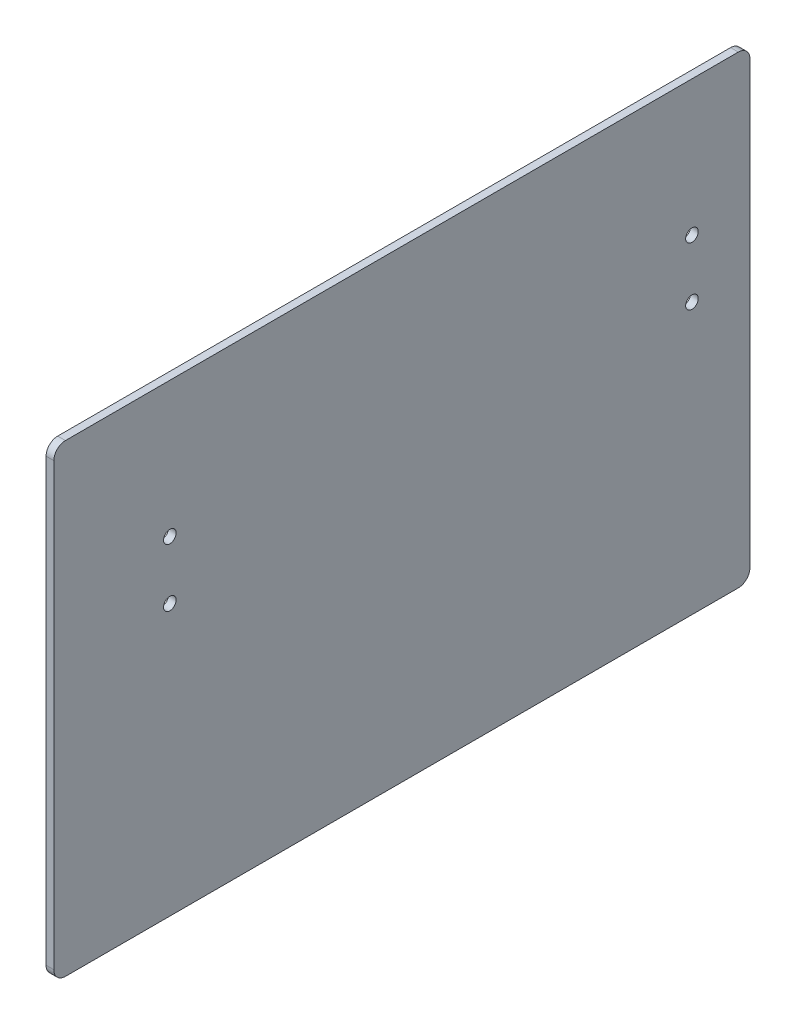
ISO-10303-21;
HEADER;
FILE_DESCRIPTION(('STEP AP214'),'2;1');
FILE_NAME('part.step','',(''),(''),'','','');
FILE_SCHEMA(('AUTOMOTIVE_DESIGN { 1 0 10303 214 1 1 1 1 }'));
ENDSEC;
DATA;
#1=APPLICATION_CONTEXT('core data for automotive mechanical design processes');
#2=APPLICATION_PROTOCOL_DEFINITION('international standard','automotive_design',2000,#1);
#3=PRODUCT_CONTEXT('',#1,'mechanical');
#4=PRODUCT('Part','Part','',(#3));
#5=PRODUCT_RELATED_PRODUCT_CATEGORY('part','',(#4));
#6=PRODUCT_DEFINITION_FORMATION('','',#4);
#7=PRODUCT_DEFINITION_CONTEXT('part definition',#1,'design');
#8=PRODUCT_DEFINITION('design','',#6,#7);
#9=PRODUCT_DEFINITION_SHAPE('','',#8);
#10=(LENGTH_UNIT() NAMED_UNIT(*) SI_UNIT(.MILLI.,.METRE.));
#11=(NAMED_UNIT(*) PLANE_ANGLE_UNIT() SI_UNIT($,.RADIAN.));
#12=(NAMED_UNIT(*) SI_UNIT($,.STERADIAN.) SOLID_ANGLE_UNIT());
#13=UNCERTAINTY_MEASURE_WITH_UNIT(LENGTH_MEASURE(1.E-05),#10,'distance_accuracy_value','');
#14=(GEOMETRIC_REPRESENTATION_CONTEXT(3) GLOBAL_UNCERTAINTY_ASSIGNED_CONTEXT((#13)) GLOBAL_UNIT_ASSIGNED_CONTEXT((#10,
#11,#12)) REPRESENTATION_CONTEXT('',''));
#15=CARTESIAN_POINT('',(0.,0.,0.));
#16=DIRECTION('',(0.,0.,1.));
#17=DIRECTION('',(1.,0.,0.));
#18=AXIS2_PLACEMENT_3D('',#15,#16,#17);
#19=CARTESIAN_POINT('',(2.,-102.75,-180.));
#20=DIRECTION('',(0.,0.,1.));
#21=DIRECTION('',(1.,0.,0.));
#22=AXIS2_PLACEMENT_3D('',#19,#20,#21);
#23=PLANE('',#22);
#24=DIRECTION('',(0.,1.,0.));
#25=VECTOR('',#24,1.);
#26=CARTESIAN_POINT('',(2.,-102.75,-180.));
#27=LINE('',#26,#25);
#28=CARTESIAN_POINT('',(2.,-96.7500000000001,-180.));
#29=VERTEX_POINT('',#28);
#30=CARTESIAN_POINT('',(2.,131.25,-180.));
#31=VERTEX_POINT('',#30);
#32=EDGE_CURVE('E133',#29,#31,#27,.T.);
#33=ORIENTED_EDGE('',*,*,#32,.F.);
#34=DIRECTION('',(-1.,0.,0.));
#35=VECTOR('',#34,1.);
#36=CARTESIAN_POINT('',(2.,-96.7500000000001,-180.));
#37=LINE('',#36,#35);
#38=CARTESIAN_POINT('',(-2.,-96.7500000000001,-180.));
#39=VERTEX_POINT('',#38);
#40=EDGE_CURVE('E160',#29,#39,#37,.T.);
#41=ORIENTED_EDGE('',*,*,#40,.T.);
#42=DIRECTION('',(0.,1.,0.));
#43=VECTOR('',#42,1.);
#44=CARTESIAN_POINT('',(-2.,-102.75,-180.));
#45=LINE('',#44,#43);
#46=CARTESIAN_POINT('',(-2.,131.25,-180.));
#47=VERTEX_POINT('',#46);
#48=EDGE_CURVE('E164',#39,#47,#45,.T.);
#49=ORIENTED_EDGE('',*,*,#48,.T.);
#50=DIRECTION('',(-1.,0.,0.));
#51=VECTOR('',#50,1.);
#52=CARTESIAN_POINT('',(2.,131.25,-180.));
#53=LINE('',#52,#51);
#54=EDGE_CURVE('E159',#47,#31,#53,.F.);
#55=ORIENTED_EDGE('',*,*,#54,.T.);
#56=EDGE_LOOP('',(#33,#41,#49,#55));
#57=FACE_BOUND('',#56,.T.);
#58=ADVANCED_FACE('F41',(#57),#23,.F.);
#59=CARTESIAN_POINT('',(2.,137.25,180.));
#60=DIRECTION('',(0.,-1.,0.));
#61=DIRECTION('',(0.,0.,-1.));
#62=AXIS2_PLACEMENT_3D('',#59,#60,#61);
#63=PLANE('',#62);
#64=DIRECTION('',(0.,0.,1.));
#65=VECTOR('',#64,1.);
#66=CARTESIAN_POINT('',(2.,137.25,180.));
#67=LINE('',#66,#65);
#68=CARTESIAN_POINT('',(2.,137.25,-174.));
#69=VERTEX_POINT('',#68);
#70=CARTESIAN_POINT('',(2.,137.25,174.));
#71=VERTEX_POINT('',#70);
#72=EDGE_CURVE('E138',#69,#71,#67,.T.);
#73=ORIENTED_EDGE('',*,*,#72,.F.);
#74=DIRECTION('',(-1.,0.,0.));
#75=VECTOR('',#74,1.);
#76=CARTESIAN_POINT('',(2.,137.25,-174.));
#77=LINE('',#76,#75);
#78=CARTESIAN_POINT('',(-2.,137.25,-174.));
#79=VERTEX_POINT('',#78);
#80=EDGE_CURVE('E11',#69,#79,#77,.T.);
#81=ORIENTED_EDGE('',*,*,#80,.T.);
#82=DIRECTION('',(0.,0.,1.));
#83=VECTOR('',#82,1.);
#84=CARTESIAN_POINT('',(-2.,137.25,180.));
#85=LINE('',#84,#83);
#86=CARTESIAN_POINT('',(-2.,137.25,174.));
#87=VERTEX_POINT('',#86);
#88=EDGE_CURVE('E137',#79,#87,#85,.T.);
#89=ORIENTED_EDGE('',*,*,#88,.T.);
#90=DIRECTION('',(-1.,0.,0.));
#91=VECTOR('',#90,1.);
#92=CARTESIAN_POINT('',(2.,137.25,174.));
#93=LINE('',#92,#91);
#94=EDGE_CURVE('E47',#87,#71,#93,.F.);
#95=ORIENTED_EDGE('',*,*,#94,.T.);
#96=EDGE_LOOP('',(#73,#81,#89,#95));
#97=FACE_BOUND('',#96,.T.);
#98=ADVANCED_FACE('F217',(#97),#63,.F.);
#99=CARTESIAN_POINT('',(2.,-102.75,180.));
#100=DIRECTION('',(0.,0.,-1.));
#101=DIRECTION('',(-1.,0.,0.));
#102=AXIS2_PLACEMENT_3D('',#99,#100,#101);
#103=PLANE('',#102);
#104=DIRECTION('',(0.,-1.,0.));
#105=VECTOR('',#104,1.);
#106=CARTESIAN_POINT('',(-2.,-102.75,180.));
#107=LINE('',#106,#105);
#108=CARTESIAN_POINT('',(-2.,131.25,180.));
#109=VERTEX_POINT('',#108);
#110=CARTESIAN_POINT('',(-2.,-96.7500000000001,180.));
#111=VERTEX_POINT('',#110);
#112=EDGE_CURVE('E132',#109,#111,#107,.T.);
#113=ORIENTED_EDGE('',*,*,#112,.T.);
#114=DIRECTION('',(-1.,0.,0.));
#115=VECTOR('',#114,1.);
#116=CARTESIAN_POINT('',(2.,-96.7500000000001,180.));
#117=LINE('',#116,#115);
#118=CARTESIAN_POINT('',(2.,-96.7500000000001,180.));
#119=VERTEX_POINT('',#118);
#120=EDGE_CURVE('E115',#111,#119,#117,.F.);
#121=ORIENTED_EDGE('',*,*,#120,.T.);
#122=DIRECTION('',(0.,-1.,0.));
#123=VECTOR('',#122,1.);
#124=CARTESIAN_POINT('',(2.,-102.75,180.));
#125=LINE('',#124,#123);
#126=CARTESIAN_POINT('',(2.,131.25,180.));
#127=VERTEX_POINT('',#126);
#128=EDGE_CURVE('E180',#127,#119,#125,.T.);
#129=ORIENTED_EDGE('',*,*,#128,.F.);
#130=DIRECTION('',(-1.,0.,0.));
#131=VECTOR('',#130,1.);
#132=CARTESIAN_POINT('',(2.,131.25,180.));
#133=LINE('',#132,#131);
#134=EDGE_CURVE('E120',#127,#109,#133,.T.);
#135=ORIENTED_EDGE('',*,*,#134,.T.);
#136=EDGE_LOOP('',(#113,#121,#129,#135));
#137=FACE_BOUND('',#136,.T.);
#138=ADVANCED_FACE('F220',(#137),#103,.F.);
#139=CARTESIAN_POINT('',(2.,-102.75,180.));
#140=DIRECTION('',(0.,1.,0.));
#141=DIRECTION('',(0.,0.,1.));
#142=AXIS2_PLACEMENT_3D('',#139,#140,#141);
#143=PLANE('',#142);
#144=DIRECTION('',(0.,0.,-1.));
#145=VECTOR('',#144,1.);
#146=CARTESIAN_POINT('',(2.,-102.75,180.));
#147=LINE('',#146,#145);
#148=CARTESIAN_POINT('',(2.,-102.75,174.));
#149=VERTEX_POINT('',#148);
#150=CARTESIAN_POINT('',(2.,-102.75,-174.));
#151=VERTEX_POINT('',#150);
#152=EDGE_CURVE('E130',#149,#151,#147,.T.);
#153=ORIENTED_EDGE('',*,*,#152,.F.);
#154=DIRECTION('',(-1.,0.,0.));
#155=VECTOR('',#154,1.);
#156=CARTESIAN_POINT('',(2.,-102.75,174.));
#157=LINE('',#156,#155);
#158=CARTESIAN_POINT('',(-2.,-102.75,174.));
#159=VERTEX_POINT('',#158);
#160=EDGE_CURVE('E111',#149,#159,#157,.T.);
#161=ORIENTED_EDGE('',*,*,#160,.T.);
#162=DIRECTION('',(0.,0.,-1.));
#163=VECTOR('',#162,1.);
#164=CARTESIAN_POINT('',(-2.,-102.75,180.));
#165=LINE('',#164,#163);
#166=CARTESIAN_POINT('',(-2.,-102.75,-174.));
#167=VERTEX_POINT('',#166);
#168=EDGE_CURVE('E121',#159,#167,#165,.T.);
#169=ORIENTED_EDGE('',*,*,#168,.T.);
#170=DIRECTION('',(-1.,0.,0.));
#171=VECTOR('',#170,1.);
#172=CARTESIAN_POINT('',(2.,-102.75,-174.));
#173=LINE('',#172,#171);
#174=EDGE_CURVE('E129',#167,#151,#173,.F.);
#175=ORIENTED_EDGE('',*,*,#174,.T.);
#176=EDGE_LOOP('',(#153,#161,#169,#175));
#177=FACE_BOUND('',#176,.T.);
#178=ADVANCED_FACE('F124',(#177),#143,.F.);
#179=CARTESIAN_POINT('',(2.,0.,0.));
#180=DIRECTION('',(-1.,0.,0.));
#181=DIRECTION('',(0.,0.,1.));
#182=AXIS2_PLACEMENT_3D('',#179,#180,#181);
#183=PLANE('',#182);
#184=CARTESIAN_POINT('',(2.,67.2499999999999,120.));
#185=DIRECTION('',(1.,0.,0.));
#186=DIRECTION('',(0.,0.,-1.));
#187=AXIS2_PLACEMENT_3D('',#184,#185,#186);
#188=CIRCLE('',#187,3.24999999999999);
#189=CARTESIAN_POINT('',(2.,67.2499999999999,116.75));
#190=VERTEX_POINT('',#189);
#191=EDGE_CURVE('E198',#190,#190,#188,.T.);
#192=ORIENTED_EDGE('',*,*,#191,.F.);
#193=EDGE_LOOP('',(#192));
#194=FACE_BOUND('',#193,.T.);
#195=CARTESIAN_POINT('',(2.,37.2499999999997,-150.));
#196=DIRECTION('',(1.,0.,0.));
#197=DIRECTION('',(0.,0.,-1.));
#198=AXIS2_PLACEMENT_3D('',#195,#196,#197);
#199=CIRCLE('',#198,3.24999999999999);
#200=CARTESIAN_POINT('',(2.,37.2499999999997,-153.25));
#201=VERTEX_POINT('',#200);
#202=EDGE_CURVE('E195',#201,#201,#199,.T.);
#203=ORIENTED_EDGE('',*,*,#202,.F.);
#204=EDGE_LOOP('',(#203));
#205=FACE_BOUND('',#204,.T.);
#206=CARTESIAN_POINT('',(2.,37.2499999999999,120.));
#207=DIRECTION('',(1.,0.,0.));
#208=DIRECTION('',(0.,0.,-1.));
#209=AXIS2_PLACEMENT_3D('',#206,#207,#208);
#210=CIRCLE('',#209,3.24999999999999);
#211=CARTESIAN_POINT('',(2.,37.2499999999999,116.75));
#212=VERTEX_POINT('',#211);
#213=EDGE_CURVE('E187',#212,#212,#210,.T.);
#214=ORIENTED_EDGE('',*,*,#213,.F.);
#215=EDGE_LOOP('',(#214));
#216=FACE_BOUND('',#215,.T.);
#217=CARTESIAN_POINT('',(2.,67.2499999999999,-150.));
#218=DIRECTION('',(1.,0.,0.));
#219=DIRECTION('',(0.,0.,-1.));
#220=AXIS2_PLACEMENT_3D('',#217,#218,#219);
#221=CIRCLE('',#220,3.24999999999999);
#222=CARTESIAN_POINT('',(2.,67.2499999999999,-153.25));
#223=VERTEX_POINT('',#222);
#224=EDGE_CURVE('E173',#223,#223,#221,.T.);
#225=ORIENTED_EDGE('',*,*,#224,.F.);
#226=EDGE_LOOP('',(#225));
#227=FACE_BOUND('',#226,.T.);
#228=ORIENTED_EDGE('',*,*,#128,.T.);
#229=CARTESIAN_POINT('',(2.,-96.7500000000001,174.));
#230=DIRECTION('',(-1.,0.,0.));
#231=DIRECTION('',(0.,0.,1.));
#232=AXIS2_PLACEMENT_3D('',#229,#230,#231);
#233=CIRCLE('',#232,6.);
#234=EDGE_CURVE('E154',#119,#149,#233,.F.);
#235=ORIENTED_EDGE('',*,*,#234,.T.);
#236=ORIENTED_EDGE('',*,*,#152,.T.);
#237=CARTESIAN_POINT('',(2.,-96.7500000000001,-174.));
#238=DIRECTION('',(-1.,0.,0.));
#239=DIRECTION('',(0.,0.,1.));
#240=AXIS2_PLACEMENT_3D('',#237,#238,#239);
#241=CIRCLE('',#240,6.);
#242=EDGE_CURVE('E153',#151,#29,#241,.F.);
#243=ORIENTED_EDGE('',*,*,#242,.T.);
#244=ORIENTED_EDGE('',*,*,#32,.T.);
#245=CARTESIAN_POINT('',(2.,131.25,-174.));
#246=DIRECTION('',(-1.,0.,0.));
#247=DIRECTION('',(0.,0.,1.));
#248=AXIS2_PLACEMENT_3D('',#245,#246,#247);
#249=CIRCLE('',#248,6.);
#250=EDGE_CURVE('E65',#31,#69,#249,.F.);
#251=ORIENTED_EDGE('',*,*,#250,.T.);
#252=ORIENTED_EDGE('',*,*,#72,.T.);
#253=CARTESIAN_POINT('',(2.,131.25,174.));
#254=DIRECTION('',(-1.,0.,0.));
#255=DIRECTION('',(0.,0.,1.));
#256=AXIS2_PLACEMENT_3D('',#253,#254,#255);
#257=CIRCLE('',#256,6.);
#258=EDGE_CURVE('E147',#71,#127,#257,.F.);
#259=ORIENTED_EDGE('',*,*,#258,.T.);
#260=EDGE_LOOP('',(#228,#235,#236,#243,#244,#251,#252,#259));
#261=FACE_BOUND('',#260,.T.);
#262=ADVANCED_FACE('F205',(#194,#205,#216,#227,#261),#183,.F.);
#263=CARTESIAN_POINT('',(-2.,0.,0.));
#264=DIRECTION('',(-1.,0.,0.));
#265=DIRECTION('',(0.,0.,1.));
#266=AXIS2_PLACEMENT_3D('',#263,#264,#265);
#267=PLANE('',#266);
#268=CARTESIAN_POINT('',(-2.,67.2499999999999,120.));
#269=DIRECTION('',(1.,0.,0.));
#270=DIRECTION('',(0.,0.,-1.));
#271=AXIS2_PLACEMENT_3D('',#268,#269,#270);
#272=CIRCLE('',#271,3.25);
#273=CARTESIAN_POINT('',(-2.,67.2499999999999,116.75));
#274=VERTEX_POINT('',#273);
#275=EDGE_CURVE('E192',#274,#274,#272,.T.);
#276=ORIENTED_EDGE('',*,*,#275,.T.);
#277=EDGE_LOOP('',(#276));
#278=FACE_BOUND('',#277,.T.);
#279=CARTESIAN_POINT('',(-2.,37.2499999999997,-150.));
#280=DIRECTION('',(1.,0.,0.));
#281=DIRECTION('',(0.,0.,-1.));
#282=AXIS2_PLACEMENT_3D('',#279,#280,#281);
#283=CIRCLE('',#282,3.25);
#284=CARTESIAN_POINT('',(-2.,37.2499999999997,-153.25));
#285=VERTEX_POINT('',#284);
#286=EDGE_CURVE('E186',#285,#285,#283,.T.);
#287=ORIENTED_EDGE('',*,*,#286,.T.);
#288=EDGE_LOOP('',(#287));
#289=FACE_BOUND('',#288,.T.);
#290=CARTESIAN_POINT('',(-2.,37.2499999999999,120.));
#291=DIRECTION('',(1.,0.,0.));
#292=DIRECTION('',(0.,0.,-1.));
#293=AXIS2_PLACEMENT_3D('',#290,#291,#292);
#294=CIRCLE('',#293,3.25);
#295=CARTESIAN_POINT('',(-2.,37.2499999999999,116.75));
#296=VERTEX_POINT('',#295);
#297=EDGE_CURVE('E182',#296,#296,#294,.T.);
#298=ORIENTED_EDGE('',*,*,#297,.T.);
#299=EDGE_LOOP('',(#298));
#300=FACE_BOUND('',#299,.T.);
#301=CARTESIAN_POINT('',(-2.,67.2499999999999,-150.));
#302=DIRECTION('',(1.,0.,0.));
#303=DIRECTION('',(0.,0.,-1.));
#304=AXIS2_PLACEMENT_3D('',#301,#302,#303);
#305=CIRCLE('',#304,3.25);
#306=CARTESIAN_POINT('',(-2.,67.2499999999999,-153.25));
#307=VERTEX_POINT('',#306);
#308=EDGE_CURVE('E167',#307,#307,#305,.T.);
#309=ORIENTED_EDGE('',*,*,#308,.T.);
#310=EDGE_LOOP('',(#309));
#311=FACE_BOUND('',#310,.T.);
#312=ORIENTED_EDGE('',*,*,#168,.F.);
#313=CARTESIAN_POINT('',(-2.,-96.7500000000001,174.));
#314=DIRECTION('',(-1.,0.,0.));
#315=DIRECTION('',(0.,0.,1.));
#316=AXIS2_PLACEMENT_3D('',#313,#314,#315);
#317=CIRCLE('',#316,6.);
#318=EDGE_CURVE('E110',#159,#111,#317,.T.);
#319=ORIENTED_EDGE('',*,*,#318,.T.);
#320=ORIENTED_EDGE('',*,*,#112,.F.);
#321=CARTESIAN_POINT('',(-2.,131.25,174.));
#322=DIRECTION('',(-1.,0.,0.));
#323=DIRECTION('',(0.,0.,1.));
#324=AXIS2_PLACEMENT_3D('',#321,#322,#323);
#325=CIRCLE('',#324,6.);
#326=EDGE_CURVE('E126',#109,#87,#325,.T.);
#327=ORIENTED_EDGE('',*,*,#326,.T.);
#328=ORIENTED_EDGE('',*,*,#88,.F.);
#329=CARTESIAN_POINT('',(-2.,131.25,-174.));
#330=DIRECTION('',(-1.,0.,0.));
#331=DIRECTION('',(0.,0.,1.));
#332=AXIS2_PLACEMENT_3D('',#329,#330,#331);
#333=CIRCLE('',#332,6.);
#334=EDGE_CURVE('E144',#79,#47,#333,.T.);
#335=ORIENTED_EDGE('',*,*,#334,.T.);
#336=ORIENTED_EDGE('',*,*,#48,.F.);
#337=CARTESIAN_POINT('',(-2.,-96.7500000000001,-174.));
#338=DIRECTION('',(-1.,0.,0.));
#339=DIRECTION('',(0.,0.,1.));
#340=AXIS2_PLACEMENT_3D('',#337,#338,#339);
#341=CIRCLE('',#340,6.);
#342=EDGE_CURVE('E117',#39,#167,#341,.T.);
#343=ORIENTED_EDGE('',*,*,#342,.T.);
#344=EDGE_LOOP('',(#312,#319,#320,#327,#328,#335,#336,#343));
#345=FACE_BOUND('',#344,.T.);
#346=ADVANCED_FACE('F131',(#278,#289,#300,#311,#345),#267,.T.);
#347=CARTESIAN_POINT('',(2.,-96.7500000000001,174.));
#348=DIRECTION('',(-1.,0.,0.));
#349=DIRECTION('',(0.,0.,1.));
#350=AXIS2_PLACEMENT_3D('',#347,#348,#349);
#351=CYLINDRICAL_SURFACE('',#350,6.);
#352=ORIENTED_EDGE('',*,*,#234,.F.);
#353=ORIENTED_EDGE('',*,*,#120,.F.);
#354=ORIENTED_EDGE('',*,*,#318,.F.);
#355=ORIENTED_EDGE('',*,*,#160,.F.);
#356=EDGE_LOOP('',(#352,#353,#354,#355));
#357=FACE_BOUND('',#356,.T.);
#358=ADVANCED_FACE('F109',(#357),#351,.T.);
#359=CARTESIAN_POINT('',(2.,-96.7500000000001,-174.));
#360=DIRECTION('',(-1.,0.,0.));
#361=DIRECTION('',(0.,0.,1.));
#362=AXIS2_PLACEMENT_3D('',#359,#360,#361);
#363=CYLINDRICAL_SURFACE('',#362,6.);
#364=ORIENTED_EDGE('',*,*,#242,.F.);
#365=ORIENTED_EDGE('',*,*,#174,.F.);
#366=ORIENTED_EDGE('',*,*,#342,.F.);
#367=ORIENTED_EDGE('',*,*,#40,.F.);
#368=EDGE_LOOP('',(#364,#365,#366,#367));
#369=FACE_BOUND('',#368,.T.);
#370=ADVANCED_FACE('F222',(#369),#363,.T.);
#371=CARTESIAN_POINT('',(2.,131.25,-174.));
#372=DIRECTION('',(-1.,0.,0.));
#373=DIRECTION('',(0.,0.,1.));
#374=AXIS2_PLACEMENT_3D('',#371,#372,#373);
#375=CYLINDRICAL_SURFACE('',#374,6.);
#376=ORIENTED_EDGE('',*,*,#250,.F.);
#377=ORIENTED_EDGE('',*,*,#54,.F.);
#378=ORIENTED_EDGE('',*,*,#334,.F.);
#379=ORIENTED_EDGE('',*,*,#80,.F.);
#380=EDGE_LOOP('',(#376,#377,#378,#379));
#381=FACE_BOUND('',#380,.T.);
#382=ADVANCED_FACE('F224',(#381),#375,.T.);
#383=CARTESIAN_POINT('',(2.,131.25,174.));
#384=DIRECTION('',(-1.,0.,0.));
#385=DIRECTION('',(0.,0.,1.));
#386=AXIS2_PLACEMENT_3D('',#383,#384,#385);
#387=CYLINDRICAL_SURFACE('',#386,6.);
#388=ORIENTED_EDGE('',*,*,#258,.F.);
#389=ORIENTED_EDGE('',*,*,#94,.F.);
#390=ORIENTED_EDGE('',*,*,#326,.F.);
#391=ORIENTED_EDGE('',*,*,#134,.F.);
#392=EDGE_LOOP('',(#388,#389,#390,#391));
#393=FACE_BOUND('',#392,.T.);
#394=ADVANCED_FACE('F43',(#393),#387,.T.);
#395=CARTESIAN_POINT('',(2.,67.2499999999999,-150.));
#396=DIRECTION('',(1.,0.,0.));
#397=DIRECTION('',(0.,0.,-1.));
#398=AXIS2_PLACEMENT_3D('',#395,#396,#397);
#399=CYLINDRICAL_SURFACE('',#398,3.25);
#400=ORIENTED_EDGE('',*,*,#308,.F.);
#401=EDGE_LOOP('',(#400));
#402=FACE_BOUND('',#401,.T.);
#403=ORIENTED_EDGE('',*,*,#224,.T.);
#404=EDGE_LOOP('',(#403));
#405=FACE_BOUND('',#404,.T.);
#406=ADVANCED_FACE('F244',(#402,#405),#399,.F.);
#407=CARTESIAN_POINT('',(2.,37.2499999999999,120.));
#408=DIRECTION('',(1.,0.,0.));
#409=DIRECTION('',(0.,0.,-1.));
#410=AXIS2_PLACEMENT_3D('',#407,#408,#409);
#411=CYLINDRICAL_SURFACE('',#410,3.24999999999999);
#412=ORIENTED_EDGE('',*,*,#297,.F.);
#413=EDGE_LOOP('',(#412));
#414=FACE_BOUND('',#413,.T.);
#415=ORIENTED_EDGE('',*,*,#213,.T.);
#416=EDGE_LOOP('',(#415));
#417=FACE_BOUND('',#416,.T.);
#418=ADVANCED_FACE('F247',(#414,#417),#411,.F.);
#419=CARTESIAN_POINT('',(2.,37.2499999999997,-150.));
#420=DIRECTION('',(1.,0.,0.));
#421=DIRECTION('',(0.,0.,-1.));
#422=AXIS2_PLACEMENT_3D('',#419,#420,#421);
#423=CYLINDRICAL_SURFACE('',#422,3.24999999999999);
#424=ORIENTED_EDGE('',*,*,#286,.F.);
#425=EDGE_LOOP('',(#424));
#426=FACE_BOUND('',#425,.T.);
#427=ORIENTED_EDGE('',*,*,#202,.T.);
#428=EDGE_LOOP('',(#427));
#429=FACE_BOUND('',#428,.T.);
#430=ADVANCED_FACE('F255',(#426,#429),#423,.F.);
#431=CARTESIAN_POINT('',(2.,67.2499999999999,120.));
#432=DIRECTION('',(1.,0.,0.));
#433=DIRECTION('',(0.,0.,-1.));
#434=AXIS2_PLACEMENT_3D('',#431,#432,#433);
#435=CYLINDRICAL_SURFACE('',#434,3.25);
#436=ORIENTED_EDGE('',*,*,#275,.F.);
#437=EDGE_LOOP('',(#436));
#438=FACE_BOUND('',#437,.T.);
#439=ORIENTED_EDGE('',*,*,#191,.T.);
#440=EDGE_LOOP('',(#439));
#441=FACE_BOUND('',#440,.T.);
#442=ADVANCED_FACE('F204',(#438,#441),#435,.F.);
#443=CLOSED_SHELL('',(#58,#98,#138,#178,#262,#346,#358,#370,#382,#394,#406,#418,#430,#442));
#444=MANIFOLD_SOLID_BREP('B2',#443);
#445=ADVANCED_BREP_SHAPE_REPRESENTATION('',(#18,#444),#14);
#446=SHAPE_DEFINITION_REPRESENTATION(#9,#445);
ENDSEC;
END-ISO-10303-21;
